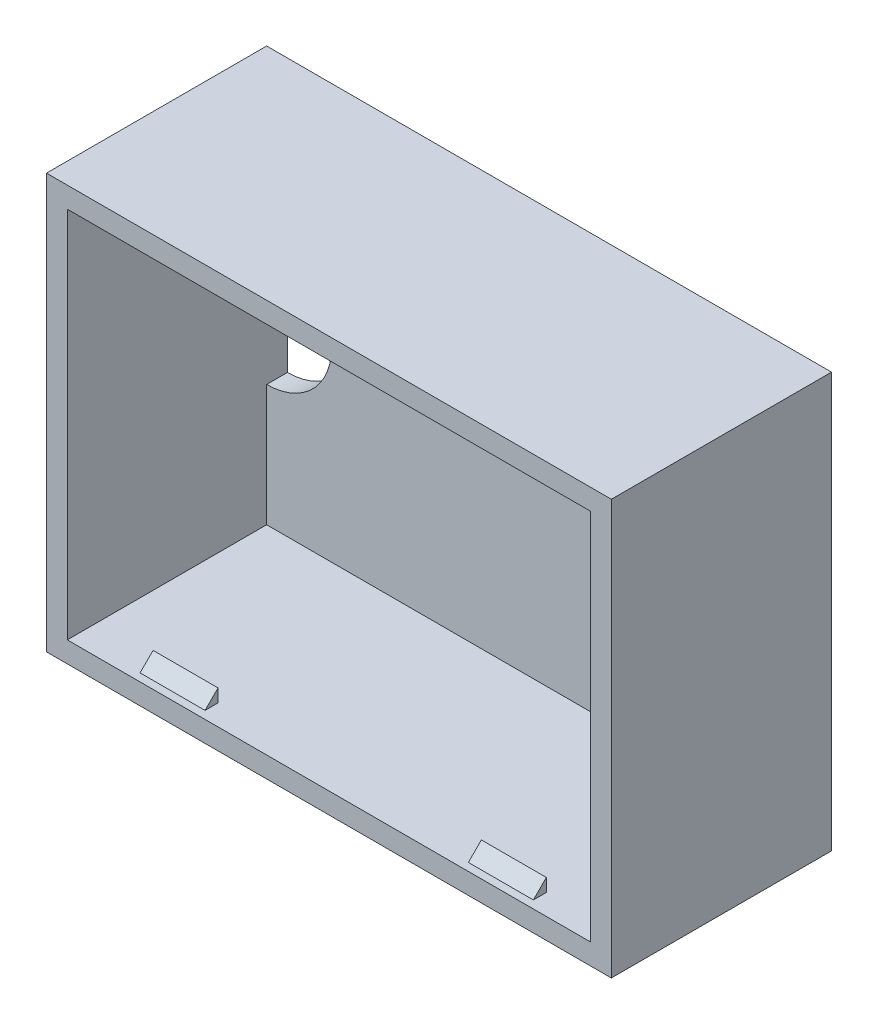
ISO-10303-21;
HEADER;
FILE_DESCRIPTION(('STEP AP214'),'2;1');
FILE_NAME('part.step','',(''),(''),'','','');
FILE_SCHEMA(('AUTOMOTIVE_DESIGN { 1 0 10303 214 1 1 1 1 }'));
ENDSEC;
DATA;
#1=APPLICATION_CONTEXT('core data for automotive mechanical design processes');
#2=APPLICATION_PROTOCOL_DEFINITION('international standard','automotive_design',2000,#1);
#3=PRODUCT_CONTEXT('',#1,'mechanical');
#4=PRODUCT('Part','Part','',(#3));
#5=PRODUCT_RELATED_PRODUCT_CATEGORY('part','',(#4));
#6=PRODUCT_DEFINITION_FORMATION('','',#4);
#7=PRODUCT_DEFINITION_CONTEXT('part definition',#1,'design');
#8=PRODUCT_DEFINITION('design','',#6,#7);
#9=PRODUCT_DEFINITION_SHAPE('','',#8);
#10=(LENGTH_UNIT() NAMED_UNIT(*) SI_UNIT(.MILLI.,.METRE.));
#11=(NAMED_UNIT(*) PLANE_ANGLE_UNIT() SI_UNIT($,.RADIAN.));
#12=(NAMED_UNIT(*) SI_UNIT($,.STERADIAN.) SOLID_ANGLE_UNIT());
#13=UNCERTAINTY_MEASURE_WITH_UNIT(LENGTH_MEASURE(1.E-05),#10,'distance_accuracy_value','');
#14=(GEOMETRIC_REPRESENTATION_CONTEXT(3) GLOBAL_UNCERTAINTY_ASSIGNED_CONTEXT((#13)) GLOBAL_UNIT_ASSIGNED_CONTEXT((#10,
#11,#12)) REPRESENTATION_CONTEXT('',''));
#15=CARTESIAN_POINT('',(0.,0.,0.));
#16=DIRECTION('',(0.,0.,1.));
#17=DIRECTION('',(1.,0.,0.));
#18=AXIS2_PLACEMENT_3D('',#15,#16,#17);
#19=CARTESIAN_POINT('',(21.73,14.35,16.94));
#20=DIRECTION('',(0.,-1.,0.));
#21=DIRECTION('',(0.,0.,-1.));
#22=AXIS2_PLACEMENT_3D('',#19,#20,#21);
#23=PLANE('',#22);
#24=DIRECTION('',(-1.,0.,0.));
#25=VECTOR('',#24,1.);
#26=CARTESIAN_POINT('',(0.,14.35,1.6));
#27=LINE('',#26,#25);
#28=CARTESIAN_POINT('',(20.13,14.35,1.6));
#29=VERTEX_POINT('',#28);
#30=CARTESIAN_POINT('',(-20.13,14.35,1.6));
#31=VERTEX_POINT('',#30);
#32=EDGE_CURVE('E294',#29,#31,#27,.T.);
#33=ORIENTED_EDGE('',*,*,#32,.F.);
#34=DIRECTION('',(0.,0.,-1.));
#35=VECTOR('',#34,1.);
#36=CARTESIAN_POINT('',(20.13,14.35,16.94));
#37=LINE('',#36,#35);
#38=CARTESIAN_POINT('',(20.13,14.35,16.94));
#39=VERTEX_POINT('',#38);
#40=EDGE_CURVE('E328',#39,#29,#37,.T.);
#41=ORIENTED_EDGE('',*,*,#40,.F.);
#42=DIRECTION('',(-1.,0.,0.));
#43=VECTOR('',#42,1.);
#44=CARTESIAN_POINT('',(0.,14.35,16.94));
#45=LINE('',#44,#43);
#46=CARTESIAN_POINT('',(-20.13,14.35,16.94));
#47=VERTEX_POINT('',#46);
#48=EDGE_CURVE('E349',#39,#47,#45,.T.);
#49=ORIENTED_EDGE('',*,*,#48,.T.);
#50=DIRECTION('',(0.,0.,-1.));
#51=VECTOR('',#50,1.);
#52=CARTESIAN_POINT('',(-20.13,14.35,16.94));
#53=LINE('',#52,#51);
#54=EDGE_CURVE('E322',#47,#31,#53,.T.);
#55=ORIENTED_EDGE('',*,*,#54,.T.);
#56=EDGE_LOOP('',(#33,#41,#49,#55));
#57=FACE_BOUND('',#56,.T.);
#58=DIRECTION('',(1.,0.,0.));
#59=VECTOR('',#58,1.);
#60=CARTESIAN_POINT('',(10.13,14.35,15.34));
#61=LINE('',#60,#59);
#62=CARTESIAN_POINT('',(10.13,14.35,15.34));
#63=VERTEX_POINT('',#62);
#64=CARTESIAN_POINT('',(15.13,14.35,15.34));
#65=VERTEX_POINT('',#64);
#66=EDGE_CURVE('E259',#63,#65,#61,.T.);
#67=ORIENTED_EDGE('',*,*,#66,.F.);
#68=DIRECTION('',(0.,0.,-1.));
#69=VECTOR('',#68,1.);
#70=CARTESIAN_POINT('',(10.13,14.35,16.34));
#71=LINE('',#70,#69);
#72=CARTESIAN_POINT('',(10.13,14.35,16.34));
#73=VERTEX_POINT('',#72);
#74=EDGE_CURVE('E229',#73,#63,#71,.T.);
#75=ORIENTED_EDGE('',*,*,#74,.F.);
#76=DIRECTION('',(-1.,0.,0.));
#77=VECTOR('',#76,1.);
#78=CARTESIAN_POINT('',(10.13,14.35,16.34));
#79=LINE('',#78,#77);
#80=CARTESIAN_POINT('',(15.13,14.35,16.34));
#81=VERTEX_POINT('',#80);
#82=EDGE_CURVE('E252',#81,#73,#79,.T.);
#83=ORIENTED_EDGE('',*,*,#82,.F.);
#84=DIRECTION('',(0.,0.,1.));
#85=VECTOR('',#84,1.);
#86=CARTESIAN_POINT('',(15.13,14.35,16.34));
#87=LINE('',#86,#85);
#88=EDGE_CURVE('E256',#65,#81,#87,.T.);
#89=ORIENTED_EDGE('',*,*,#88,.F.);
#90=EDGE_LOOP('',(#67,#75,#83,#89));
#91=FACE_BOUND('',#90,.T.);
#92=DIRECTION('',(1.,0.,0.));
#93=VECTOR('',#92,1.);
#94=CARTESIAN_POINT('',(-15.13,14.35,15.34));
#95=LINE('',#94,#93);
#96=CARTESIAN_POINT('',(-15.13,14.35,15.34));
#97=VERTEX_POINT('',#96);
#98=CARTESIAN_POINT('',(-10.13,14.35,15.34));
#99=VERTEX_POINT('',#98);
#100=EDGE_CURVE('E228',#97,#99,#95,.T.);
#101=ORIENTED_EDGE('',*,*,#100,.F.);
#102=DIRECTION('',(0.,0.,-1.));
#103=VECTOR('',#102,1.);
#104=CARTESIAN_POINT('',(-15.13,14.35,16.34));
#105=LINE('',#104,#103);
#106=CARTESIAN_POINT('',(-15.13,14.35,16.34));
#107=VERTEX_POINT('',#106);
#108=EDGE_CURVE('E224',#107,#97,#105,.T.);
#109=ORIENTED_EDGE('',*,*,#108,.F.);
#110=DIRECTION('',(-1.,0.,0.));
#111=VECTOR('',#110,1.);
#112=CARTESIAN_POINT('',(-15.13,14.35,16.34));
#113=LINE('',#112,#111);
#114=CARTESIAN_POINT('',(-10.13,14.35,16.34));
#115=VERTEX_POINT('',#114);
#116=EDGE_CURVE('E223',#115,#107,#113,.T.);
#117=ORIENTED_EDGE('',*,*,#116,.F.);
#118=DIRECTION('',(0.,0.,1.));
#119=VECTOR('',#118,1.);
#120=CARTESIAN_POINT('',(-10.13,14.35,16.34));
#121=LINE('',#120,#119);
#122=EDGE_CURVE('E232',#99,#115,#121,.T.);
#123=ORIENTED_EDGE('',*,*,#122,.F.);
#124=EDGE_LOOP('',(#101,#109,#117,#123));
#125=FACE_BOUND('',#124,.T.);
#126=ADVANCED_FACE('F47',(#57,#91,#125),#23,.T.);
#127=CARTESIAN_POINT('',(21.73,-14.35,16.94));
#128=DIRECTION('',(0.,1.,0.));
#129=DIRECTION('',(0.,0.,1.));
#130=AXIS2_PLACEMENT_3D('',#127,#128,#129);
#131=PLANE('',#130);
#132=DIRECTION('',(1.,0.,0.));
#133=VECTOR('',#132,1.);
#134=CARTESIAN_POINT('',(0.,-14.35,1.6));
#135=LINE('',#134,#133);
#136=CARTESIAN_POINT('',(-20.13,-14.35,1.6));
#137=VERTEX_POINT('',#136);
#138=CARTESIAN_POINT('',(20.13,-14.35,1.6));
#139=VERTEX_POINT('',#138);
#140=EDGE_CURVE('E337',#137,#139,#135,.T.);
#141=ORIENTED_EDGE('',*,*,#140,.F.);
#142=DIRECTION('',(0.,0.,-1.));
#143=VECTOR('',#142,1.);
#144=CARTESIAN_POINT('',(-20.13,-14.35,16.94));
#145=LINE('',#144,#143);
#146=CARTESIAN_POINT('',(-20.13,-14.35,16.94));
#147=VERTEX_POINT('',#146);
#148=EDGE_CURVE('E327',#147,#137,#145,.T.);
#149=ORIENTED_EDGE('',*,*,#148,.F.);
#150=DIRECTION('',(1.,0.,0.));
#151=VECTOR('',#150,1.);
#152=CARTESIAN_POINT('',(0.,-14.35,16.94));
#153=LINE('',#152,#151);
#154=CARTESIAN_POINT('',(20.13,-14.35,16.94));
#155=VERTEX_POINT('',#154);
#156=EDGE_CURVE('E355',#147,#155,#153,.T.);
#157=ORIENTED_EDGE('',*,*,#156,.T.);
#158=DIRECTION('',(0.,0.,-1.));
#159=VECTOR('',#158,1.);
#160=CARTESIAN_POINT('',(20.13,-14.35,16.94));
#161=LINE('',#160,#159);
#162=EDGE_CURVE('E332',#155,#139,#161,.T.);
#163=ORIENTED_EDGE('',*,*,#162,.T.);
#164=EDGE_LOOP('',(#141,#149,#157,#163));
#165=FACE_BOUND('',#164,.T.);
#166=DIRECTION('',(-1.,0.,0.));
#167=VECTOR('',#166,1.);
#168=CARTESIAN_POINT('',(-10.13,-14.35,15.34));
#169=LINE('',#168,#167);
#170=CARTESIAN_POINT('',(-10.13,-14.35,15.34));
#171=VERTEX_POINT('',#170);
#172=CARTESIAN_POINT('',(-15.13,-14.35,15.34));
#173=VERTEX_POINT('',#172);
#174=EDGE_CURVE('E309',#171,#173,#169,.T.);
#175=ORIENTED_EDGE('',*,*,#174,.F.);
#176=DIRECTION('',(0.,0.,-1.));
#177=VECTOR('',#176,1.);
#178=CARTESIAN_POINT('',(-10.13,-14.35,16.34));
#179=LINE('',#178,#177);
#180=CARTESIAN_POINT('',(-10.13,-14.35,16.34));
#181=VERTEX_POINT('',#180);
#182=EDGE_CURVE('E279',#181,#171,#179,.T.);
#183=ORIENTED_EDGE('',*,*,#182,.F.);
#184=DIRECTION('',(1.,0.,0.));
#185=VECTOR('',#184,1.);
#186=CARTESIAN_POINT('',(-10.13,-14.35,16.34));
#187=LINE('',#186,#185);
#188=CARTESIAN_POINT('',(-15.13,-14.35,16.34));
#189=VERTEX_POINT('',#188);
#190=EDGE_CURVE('E302',#189,#181,#187,.T.);
#191=ORIENTED_EDGE('',*,*,#190,.F.);
#192=DIRECTION('',(0.,0.,1.));
#193=VECTOR('',#192,1.);
#194=CARTESIAN_POINT('',(-15.13,-14.35,16.34));
#195=LINE('',#194,#193);
#196=EDGE_CURVE('E306',#173,#189,#195,.T.);
#197=ORIENTED_EDGE('',*,*,#196,.F.);
#198=EDGE_LOOP('',(#175,#183,#191,#197));
#199=FACE_BOUND('',#198,.T.);
#200=DIRECTION('',(-1.,0.,0.));
#201=VECTOR('',#200,1.);
#202=CARTESIAN_POINT('',(15.13,-14.35,15.34));
#203=LINE('',#202,#201);
#204=CARTESIAN_POINT('',(15.13,-14.35,15.34));
#205=VERTEX_POINT('',#204);
#206=CARTESIAN_POINT('',(10.13,-14.35,15.34));
#207=VERTEX_POINT('',#206);
#208=EDGE_CURVE('E278',#205,#207,#203,.T.);
#209=ORIENTED_EDGE('',*,*,#208,.F.);
#210=DIRECTION('',(0.,0.,-1.));
#211=VECTOR('',#210,1.);
#212=CARTESIAN_POINT('',(15.13,-14.35,16.34));
#213=LINE('',#212,#211);
#214=CARTESIAN_POINT('',(15.13,-14.35,16.34));
#215=VERTEX_POINT('',#214);
#216=EDGE_CURVE('E274',#215,#205,#213,.T.);
#217=ORIENTED_EDGE('',*,*,#216,.F.);
#218=DIRECTION('',(1.,0.,0.));
#219=VECTOR('',#218,1.);
#220=CARTESIAN_POINT('',(15.13,-14.35,16.34));
#221=LINE('',#220,#219);
#222=CARTESIAN_POINT('',(10.13,-14.35,16.34));
#223=VERTEX_POINT('',#222);
#224=EDGE_CURVE('E273',#223,#215,#221,.T.);
#225=ORIENTED_EDGE('',*,*,#224,.F.);
#226=DIRECTION('',(0.,0.,1.));
#227=VECTOR('',#226,1.);
#228=CARTESIAN_POINT('',(10.13,-14.35,16.34));
#229=LINE('',#228,#227);
#230=EDGE_CURVE('E282',#207,#223,#229,.T.);
#231=ORIENTED_EDGE('',*,*,#230,.F.);
#232=EDGE_LOOP('',(#209,#217,#225,#231));
#233=FACE_BOUND('',#232,.T.);
#234=ADVANCED_FACE('F448',(#165,#199,#233),#131,.T.);
#235=CARTESIAN_POINT('',(0.,0.,16.94));
#236=DIRECTION('',(0.,0.,-1.));
#237=DIRECTION('',(-1.,0.,0.));
#238=AXIS2_PLACEMENT_3D('',#235,#236,#237);
#239=PLANE('',#238);
#240=DIRECTION('',(-1.,0.,0.));
#241=VECTOR('',#240,1.);
#242=CARTESIAN_POINT('',(21.73,15.95,16.94));
#243=LINE('',#242,#241);
#244=CARTESIAN_POINT('',(21.73,15.95,16.94));
#245=VERTEX_POINT('',#244);
#246=CARTESIAN_POINT('',(-21.73,15.95,16.94));
#247=VERTEX_POINT('',#246);
#248=EDGE_CURVE('E361',#245,#247,#243,.T.);
#249=ORIENTED_EDGE('',*,*,#248,.T.);
#250=DIRECTION('',(0.,-1.,0.));
#251=VECTOR('',#250,1.);
#252=CARTESIAN_POINT('',(-21.73,-15.95,16.94));
#253=LINE('',#252,#251);
#254=CARTESIAN_POINT('',(-21.73,-15.95,16.94));
#255=VERTEX_POINT('',#254);
#256=EDGE_CURVE('E365',#247,#255,#253,.T.);
#257=ORIENTED_EDGE('',*,*,#256,.T.);
#258=DIRECTION('',(1.,0.,0.));
#259=VECTOR('',#258,1.);
#260=CARTESIAN_POINT('',(21.73,-15.95,16.94));
#261=LINE('',#260,#259);
#262=CARTESIAN_POINT('',(21.73,-15.95,16.94));
#263=VERTEX_POINT('',#262);
#264=EDGE_CURVE('E369',#255,#263,#261,.T.);
#265=ORIENTED_EDGE('',*,*,#264,.T.);
#266=DIRECTION('',(0.,1.,0.));
#267=VECTOR('',#266,1.);
#268=CARTESIAN_POINT('',(21.73,-15.95,16.94));
#269=LINE('',#268,#267);
#270=EDGE_CURVE('E372',#263,#245,#269,.T.);
#271=ORIENTED_EDGE('',*,*,#270,.T.);
#272=EDGE_LOOP('',(#249,#257,#265,#271));
#273=FACE_BOUND('',#272,.T.);
#274=ORIENTED_EDGE('',*,*,#48,.F.);
#275=DIRECTION('',(0.,1.,0.));
#276=VECTOR('',#275,1.);
#277=CARTESIAN_POINT('',(20.13,0.,16.94));
#278=LINE('',#277,#276);
#279=EDGE_CURVE('E333',#155,#39,#278,.T.);
#280=ORIENTED_EDGE('',*,*,#279,.F.);
#281=ORIENTED_EDGE('',*,*,#156,.F.);
#282=DIRECTION('',(0.,-1.,0.));
#283=VECTOR('',#282,1.);
#284=CARTESIAN_POINT('',(-20.13,0.,16.94));
#285=LINE('',#284,#283);
#286=EDGE_CURVE('E352',#47,#147,#285,.T.);
#287=ORIENTED_EDGE('',*,*,#286,.F.);
#288=EDGE_LOOP('',(#274,#280,#281,#287));
#289=FACE_BOUND('',#288,.T.);
#290=ADVANCED_FACE('F455',(#273,#289),#239,.F.);
#291=CARTESIAN_POINT('',(21.73,15.95,16.94));
#292=DIRECTION('',(0.,-1.,0.));
#293=DIRECTION('',(0.,0.,-1.));
#294=AXIS2_PLACEMENT_3D('',#291,#292,#293);
#295=PLANE('',#294);
#296=DIRECTION('',(-1.,0.,0.));
#297=VECTOR('',#296,1.);
#298=CARTESIAN_POINT('',(21.73,15.95,0.));
#299=LINE('',#298,#297);
#300=CARTESIAN_POINT('',(21.73,15.95,0.));
#301=VERTEX_POINT('',#300);
#302=CARTESIAN_POINT('',(-21.73,15.95,0.));
#303=VERTEX_POINT('',#302);
#304=EDGE_CURVE('E326',#301,#303,#299,.T.);
#305=ORIENTED_EDGE('',*,*,#304,.T.);
#306=DIRECTION('',(0.,0.,-1.));
#307=VECTOR('',#306,1.);
#308=CARTESIAN_POINT('',(-21.73,15.95,16.94));
#309=LINE('',#308,#307);
#310=EDGE_CURVE('E398',#247,#303,#309,.T.);
#311=ORIENTED_EDGE('',*,*,#310,.F.);
#312=ORIENTED_EDGE('',*,*,#248,.F.);
#313=DIRECTION('',(0.,0.,-1.));
#314=VECTOR('',#313,1.);
#315=CARTESIAN_POINT('',(21.73,15.95,16.94));
#316=LINE('',#315,#314);
#317=EDGE_CURVE('E375',#245,#301,#316,.T.);
#318=ORIENTED_EDGE('',*,*,#317,.T.);
#319=EDGE_LOOP('',(#305,#311,#312,#318));
#320=FACE_BOUND('',#319,.T.);
#321=ADVANCED_FACE('F475',(#320),#295,.F.);
#322=CARTESIAN_POINT('',(-21.73,-15.95,16.94));
#323=DIRECTION('',(1.,0.,0.));
#324=DIRECTION('',(0.,0.,-1.));
#325=AXIS2_PLACEMENT_3D('',#322,#323,#324);
#326=PLANE('',#325);
#327=DIRECTION('',(0.,-1.,0.));
#328=VECTOR('',#327,1.);
#329=CARTESIAN_POINT('',(-21.73,-15.95,0.));
#330=LINE('',#329,#328);
#331=CARTESIAN_POINT('',(-21.73,-15.95,0.));
#332=VERTEX_POINT('',#331);
#333=EDGE_CURVE('E379',#303,#332,#330,.T.);
#334=ORIENTED_EDGE('',*,*,#333,.T.);
#335=DIRECTION('',(0.,0.,-1.));
#336=VECTOR('',#335,1.);
#337=CARTESIAN_POINT('',(-21.73,-15.95,16.94));
#338=LINE('',#337,#336);
#339=EDGE_CURVE('E394',#255,#332,#338,.T.);
#340=ORIENTED_EDGE('',*,*,#339,.F.);
#341=ORIENTED_EDGE('',*,*,#256,.F.);
#342=ORIENTED_EDGE('',*,*,#310,.T.);
#343=EDGE_LOOP('',(#334,#340,#341,#342));
#344=FACE_BOUND('',#343,.T.);
#345=ADVANCED_FACE('F486',(#344),#326,.F.);
#346=CARTESIAN_POINT('',(21.73,-15.95,16.94));
#347=DIRECTION('',(0.,1.,0.));
#348=DIRECTION('',(0.,0.,1.));
#349=AXIS2_PLACEMENT_3D('',#346,#347,#348);
#350=PLANE('',#349);
#351=DIRECTION('',(1.,0.,0.));
#352=VECTOR('',#351,1.);
#353=CARTESIAN_POINT('',(21.73,-15.95,0.));
#354=LINE('',#353,#352);
#355=CARTESIAN_POINT('',(21.73,-15.95,0.));
#356=VERTEX_POINT('',#355);
#357=EDGE_CURVE('E382',#332,#356,#354,.T.);
#358=ORIENTED_EDGE('',*,*,#357,.T.);
#359=DIRECTION('',(0.,0.,-1.));
#360=VECTOR('',#359,1.);
#361=CARTESIAN_POINT('',(21.73,-15.95,16.94));
#362=LINE('',#361,#360);
#363=EDGE_CURVE('E390',#263,#356,#362,.T.);
#364=ORIENTED_EDGE('',*,*,#363,.F.);
#365=ORIENTED_EDGE('',*,*,#264,.F.);
#366=ORIENTED_EDGE('',*,*,#339,.T.);
#367=EDGE_LOOP('',(#358,#364,#365,#366));
#368=FACE_BOUND('',#367,.T.);
#369=ADVANCED_FACE('F482',(#368),#350,.F.);
#370=CARTESIAN_POINT('',(21.73,-15.95,16.94));
#371=DIRECTION('',(-1.,0.,0.));
#372=DIRECTION('',(0.,0.,1.));
#373=AXIS2_PLACEMENT_3D('',#370,#371,#372);
#374=PLANE('',#373);
#375=DIRECTION('',(0.,1.,0.));
#376=VECTOR('',#375,1.);
#377=CARTESIAN_POINT('',(21.73,-15.95,0.));
#378=LINE('',#377,#376);
#379=EDGE_CURVE('E366',#356,#301,#378,.T.);
#380=ORIENTED_EDGE('',*,*,#379,.T.);
#381=ORIENTED_EDGE('',*,*,#317,.F.);
#382=ORIENTED_EDGE('',*,*,#270,.F.);
#383=ORIENTED_EDGE('',*,*,#363,.T.);
#384=EDGE_LOOP('',(#380,#381,#382,#383));
#385=FACE_BOUND('',#384,.T.);
#386=ADVANCED_FACE('F479',(#385),#374,.F.);
#387=CARTESIAN_POINT('',(0.,0.,0.));
#388=DIRECTION('',(0.,0.,-1.));
#389=DIRECTION('',(-1.,0.,0.));
#390=AXIS2_PLACEMENT_3D('',#387,#388,#389);
#391=PLANE('',#390);
#392=CARTESIAN_POINT('',(-20.13,0.,0.));
#393=DIRECTION('',(0.,0.,1.));
#394=DIRECTION('',(1.,0.,0.));
#395=AXIS2_PLACEMENT_3D('',#392,#393,#394);
#396=CIRCLE('',#395,5.);
#397=CARTESIAN_POINT('',(-20.13,-5.00000000000001,0.));
#398=VERTEX_POINT('',#397);
#399=CARTESIAN_POINT('',(-20.13,4.99999999999999,0.));
#400=VERTEX_POINT('',#399);
#401=EDGE_CURVE('E69',#398,#400,#396,.T.);
#402=ORIENTED_EDGE('',*,*,#401,.T.);
#403=DIRECTION('',(0.,-1.,0.));
#404=VECTOR('',#403,1.);
#405=CARTESIAN_POINT('',(-20.13,4.99999999999999,0.));
#406=LINE('',#405,#404);
#407=EDGE_CURVE('E200',#400,#398,#406,.T.);
#408=ORIENTED_EDGE('',*,*,#407,.T.);
#409=EDGE_LOOP('',(#402,#408));
#410=FACE_BOUND('',#409,.T.);
#411=ORIENTED_EDGE('',*,*,#304,.F.);
#412=ORIENTED_EDGE('',*,*,#379,.F.);
#413=ORIENTED_EDGE('',*,*,#357,.F.);
#414=ORIENTED_EDGE('',*,*,#333,.F.);
#415=EDGE_LOOP('',(#411,#412,#413,#414));
#416=FACE_BOUND('',#415,.T.);
#417=ADVANCED_FACE('F208',(#410,#416),#391,.T.);
#418=CARTESIAN_POINT('',(-20.13,-15.95,16.94));
#419=DIRECTION('',(1.,0.,0.));
#420=DIRECTION('',(0.,0.,-1.));
#421=AXIS2_PLACEMENT_3D('',#418,#419,#420);
#422=PLANE('',#421);
#423=DIRECTION('',(0.,-1.,0.));
#424=VECTOR('',#423,1.);
#425=CARTESIAN_POINT('',(-20.13,0.,1.6));
#426=LINE('',#425,#424);
#427=CARTESIAN_POINT('',(-20.13,4.99999999999999,1.6));
#428=VERTEX_POINT('',#427);
#429=EDGE_CURVE('E334',#31,#428,#426,.T.);
#430=ORIENTED_EDGE('',*,*,#429,.F.);
#431=ORIENTED_EDGE('',*,*,#54,.F.);
#432=ORIENTED_EDGE('',*,*,#286,.T.);
#433=ORIENTED_EDGE('',*,*,#148,.T.);
#434=CARTESIAN_POINT('',(-20.13,-5.,1.6));
#435=VERTEX_POINT('',#434);
#436=EDGE_CURVE('E321',#435,#137,#426,.T.);
#437=ORIENTED_EDGE('',*,*,#436,.F.);
#438=DIRECTION('',(0.,0.,1.));
#439=VECTOR('',#438,1.);
#440=CARTESIAN_POINT('',(-20.13,-5.00000000000001,0.));
#441=LINE('',#440,#439);
#442=EDGE_CURVE('E64',#398,#435,#441,.T.);
#443=ORIENTED_EDGE('',*,*,#442,.F.);
#444=ORIENTED_EDGE('',*,*,#407,.F.);
#445=DIRECTION('',(0.,0.,1.));
#446=VECTOR('',#445,1.);
#447=CARTESIAN_POINT('',(-20.13,4.99999999999999,0.));
#448=LINE('',#447,#446);
#449=EDGE_CURVE('E193',#400,#428,#448,.T.);
#450=ORIENTED_EDGE('',*,*,#449,.T.);
#451=EDGE_LOOP('',(#430,#431,#432,#433,#437,#443,#444,#450));
#452=FACE_BOUND('',#451,.T.);
#453=ADVANCED_FACE('F203',(#452),#422,.T.);
#454=CARTESIAN_POINT('',(20.13,-15.95,16.94));
#455=DIRECTION('',(-1.,0.,0.));
#456=DIRECTION('',(0.,0.,1.));
#457=AXIS2_PLACEMENT_3D('',#454,#455,#456);
#458=PLANE('',#457);
#459=DIRECTION('',(0.,1.,0.));
#460=VECTOR('',#459,1.);
#461=CARTESIAN_POINT('',(20.13,0.,1.6));
#462=LINE('',#461,#460);
#463=EDGE_CURVE('E343',#139,#29,#462,.T.);
#464=ORIENTED_EDGE('',*,*,#463,.F.);
#465=ORIENTED_EDGE('',*,*,#162,.F.);
#466=ORIENTED_EDGE('',*,*,#279,.T.);
#467=ORIENTED_EDGE('',*,*,#40,.T.);
#468=EDGE_LOOP('',(#464,#465,#466,#467));
#469=FACE_BOUND('',#468,.T.);
#470=ADVANCED_FACE('F464',(#469),#458,.T.);
#471=CARTESIAN_POINT('',(0.,0.,1.6));
#472=DIRECTION('',(0.,0.,-1.));
#473=DIRECTION('',(-1.,0.,0.));
#474=AXIS2_PLACEMENT_3D('',#471,#472,#473);
#475=PLANE('',#474);
#476=CARTESIAN_POINT('',(-20.13,0.,1.6));
#477=DIRECTION('',(0.,0.,1.));
#478=DIRECTION('',(1.,0.,0.));
#479=AXIS2_PLACEMENT_3D('',#476,#477,#478);
#480=CIRCLE('',#479,5.);
#481=EDGE_CURVE('E196',#435,#428,#480,.T.);
#482=ORIENTED_EDGE('',*,*,#481,.F.);
#483=ORIENTED_EDGE('',*,*,#436,.T.);
#484=ORIENTED_EDGE('',*,*,#140,.T.);
#485=ORIENTED_EDGE('',*,*,#463,.T.);
#486=ORIENTED_EDGE('',*,*,#32,.T.);
#487=ORIENTED_EDGE('',*,*,#429,.T.);
#488=EDGE_LOOP('',(#482,#483,#484,#485,#486,#487));
#489=FACE_BOUND('',#488,.T.);
#490=ADVANCED_FACE('F467',(#489),#475,.F.);
#491=CARTESIAN_POINT('',(-10.13,-13.35,16.34));
#492=DIRECTION('',(-1.,0.,0.));
#493=DIRECTION('',(0.,0.,1.));
#494=AXIS2_PLACEMENT_3D('',#491,#492,#493);
#495=PLANE('',#494);
#496=DIRECTION('',(0.,-1.,0.));
#497=VECTOR('',#496,1.);
#498=CARTESIAN_POINT('',(-10.13,-13.35,15.34));
#499=LINE('',#498,#497);
#500=CARTESIAN_POINT('',(-10.13,-13.35,15.34));
#501=VERTEX_POINT('',#500);
#502=EDGE_CURVE('E244',#501,#171,#499,.T.);
#503=ORIENTED_EDGE('',*,*,#502,.F.);
#504=DIRECTION('',(0.,-0.70710678118655,0.707106781186545));
#505=VECTOR('',#504,1.);
#506=CARTESIAN_POINT('',(-10.13,-13.35,15.34));
#507=LINE('',#506,#505);
#508=EDGE_CURVE('E402',#501,#181,#507,.T.);
#509=ORIENTED_EDGE('',*,*,#508,.T.);
#510=ORIENTED_EDGE('',*,*,#182,.T.);
#511=EDGE_LOOP('',(#503,#509,#510));
#512=FACE_BOUND('',#511,.T.);
#513=ADVANCED_FACE('F471',(#512),#495,.F.);
#514=CARTESIAN_POINT('',(-10.13,-13.35,15.34));
#515=DIRECTION('',(0.,0.,1.));
#516=DIRECTION('',(1.,0.,0.));
#517=AXIS2_PLACEMENT_3D('',#514,#515,#516);
#518=PLANE('',#517);
#519=ORIENTED_EDGE('',*,*,#174,.T.);
#520=DIRECTION('',(0.,-1.,0.));
#521=VECTOR('',#520,1.);
#522=CARTESIAN_POINT('',(-15.13,-13.35,15.34));
#523=LINE('',#522,#521);
#524=CARTESIAN_POINT('',(-15.13,-13.35,15.34));
#525=VERTEX_POINT('',#524);
#526=EDGE_CURVE('E297',#525,#173,#523,.T.);
#527=ORIENTED_EDGE('',*,*,#526,.F.);
#528=DIRECTION('',(-1.,0.,0.));
#529=VECTOR('',#528,1.);
#530=CARTESIAN_POINT('',(-10.13,-13.35,15.34));
#531=LINE('',#530,#529);
#532=EDGE_CURVE('E301',#501,#525,#531,.T.);
#533=ORIENTED_EDGE('',*,*,#532,.F.);
#534=ORIENTED_EDGE('',*,*,#502,.T.);
#535=EDGE_LOOP('',(#519,#527,#533,#534));
#536=FACE_BOUND('',#535,.T.);
#537=ADVANCED_FACE('F656',(#536),#518,.F.);
#538=CARTESIAN_POINT('',(-15.13,-13.35,16.34));
#539=DIRECTION('',(1.,0.,0.));
#540=DIRECTION('',(0.,0.,-1.));
#541=AXIS2_PLACEMENT_3D('',#538,#539,#540);
#542=PLANE('',#541);
#543=ORIENTED_EDGE('',*,*,#196,.T.);
#544=DIRECTION('',(0.,0.70710678118655,-0.707106781186545));
#545=VECTOR('',#544,1.);
#546=CARTESIAN_POINT('',(-15.13,-13.35,15.34));
#547=LINE('',#546,#545);
#548=EDGE_CURVE('E405',#189,#525,#547,.T.);
#549=ORIENTED_EDGE('',*,*,#548,.T.);
#550=ORIENTED_EDGE('',*,*,#526,.T.);
#551=EDGE_LOOP('',(#543,#549,#550));
#552=FACE_BOUND('',#551,.T.);
#553=ADVANCED_FACE('F461',(#552),#542,.F.);
#554=CARTESIAN_POINT('',(15.13,-13.35,16.34));
#555=DIRECTION('',(-1.,0.,0.));
#556=DIRECTION('',(0.,0.,1.));
#557=AXIS2_PLACEMENT_3D('',#554,#555,#556);
#558=PLANE('',#557);
#559=DIRECTION('',(0.,-1.,0.));
#560=VECTOR('',#559,1.);
#561=CARTESIAN_POINT('',(15.13,-13.35,15.34));
#562=LINE('',#561,#560);
#563=CARTESIAN_POINT('',(15.13,-13.35,15.34));
#564=VERTEX_POINT('',#563);
#565=EDGE_CURVE('E291',#564,#205,#562,.T.);
#566=ORIENTED_EDGE('',*,*,#565,.F.);
#567=DIRECTION('',(0.,-0.70710678118655,0.707106781186545));
#568=VECTOR('',#567,1.);
#569=CARTESIAN_POINT('',(15.13,-13.35,15.34));
#570=LINE('',#569,#568);
#571=EDGE_CURVE('E408',#564,#215,#570,.T.);
#572=ORIENTED_EDGE('',*,*,#571,.T.);
#573=ORIENTED_EDGE('',*,*,#216,.T.);
#574=EDGE_LOOP('',(#566,#572,#573));
#575=FACE_BOUND('',#574,.T.);
#576=ADVANCED_FACE('F637',(#575),#558,.F.);
#577=CARTESIAN_POINT('',(15.13,-13.35,15.34));
#578=DIRECTION('',(0.,0.,1.));
#579=DIRECTION('',(1.,0.,0.));
#580=AXIS2_PLACEMENT_3D('',#577,#578,#579);
#581=PLANE('',#580);
#582=ORIENTED_EDGE('',*,*,#208,.T.);
#583=DIRECTION('',(0.,-1.,0.));
#584=VECTOR('',#583,1.);
#585=CARTESIAN_POINT('',(10.13,-13.35,15.34));
#586=LINE('',#585,#584);
#587=CARTESIAN_POINT('',(10.13,-13.35,15.34));
#588=VERTEX_POINT('',#587);
#589=EDGE_CURVE('E272',#588,#207,#586,.T.);
#590=ORIENTED_EDGE('',*,*,#589,.F.);
#591=DIRECTION('',(-1.,0.,0.));
#592=VECTOR('',#591,1.);
#593=CARTESIAN_POINT('',(15.13,-13.35,15.34));
#594=LINE('',#593,#592);
#595=EDGE_CURVE('E268',#564,#588,#594,.T.);
#596=ORIENTED_EDGE('',*,*,#595,.F.);
#597=ORIENTED_EDGE('',*,*,#565,.T.);
#598=EDGE_LOOP('',(#582,#590,#596,#597));
#599=FACE_BOUND('',#598,.T.);
#600=ADVANCED_FACE('F627',(#599),#581,.F.);
#601=CARTESIAN_POINT('',(10.13,-13.35,16.34));
#602=DIRECTION('',(1.,0.,0.));
#603=DIRECTION('',(0.,0.,-1.));
#604=AXIS2_PLACEMENT_3D('',#601,#602,#603);
#605=PLANE('',#604);
#606=ORIENTED_EDGE('',*,*,#230,.T.);
#607=DIRECTION('',(0.,0.70710678118655,-0.707106781186545));
#608=VECTOR('',#607,1.);
#609=CARTESIAN_POINT('',(10.13,-13.35,15.34));
#610=LINE('',#609,#608);
#611=EDGE_CURVE('E411',#223,#588,#610,.T.);
#612=ORIENTED_EDGE('',*,*,#611,.T.);
#613=ORIENTED_EDGE('',*,*,#589,.T.);
#614=EDGE_LOOP('',(#606,#612,#613));
#615=FACE_BOUND('',#614,.T.);
#616=ADVANCED_FACE('F445',(#615),#605,.F.);
#617=CARTESIAN_POINT('',(10.13,13.35,16.34));
#618=DIRECTION('',(1.,0.,0.));
#619=DIRECTION('',(0.,0.,-1.));
#620=AXIS2_PLACEMENT_3D('',#617,#618,#619);
#621=PLANE('',#620);
#622=DIRECTION('',(0.,1.,0.));
#623=VECTOR('',#622,1.);
#624=CARTESIAN_POINT('',(10.13,13.35,15.34));
#625=LINE('',#624,#623);
#626=CARTESIAN_POINT('',(10.13,13.35,15.34));
#627=VERTEX_POINT('',#626);
#628=EDGE_CURVE('E216',#627,#63,#625,.T.);
#629=ORIENTED_EDGE('',*,*,#628,.F.);
#630=DIRECTION('',(0.,0.70710678118655,0.707106781186545));
#631=VECTOR('',#630,1.);
#632=CARTESIAN_POINT('',(10.13,13.35,15.34));
#633=LINE('',#632,#631);
#634=EDGE_CURVE('E57',#627,#73,#633,.T.);
#635=ORIENTED_EDGE('',*,*,#634,.T.);
#636=ORIENTED_EDGE('',*,*,#74,.T.);
#637=EDGE_LOOP('',(#629,#635,#636));
#638=FACE_BOUND('',#637,.T.);
#639=ADVANCED_FACE('F423',(#638),#621,.F.);
#640=CARTESIAN_POINT('',(10.13,13.35,15.34));
#641=DIRECTION('',(0.,0.,1.));
#642=DIRECTION('',(1.,0.,0.));
#643=AXIS2_PLACEMENT_3D('',#640,#641,#642);
#644=PLANE('',#643);
#645=ORIENTED_EDGE('',*,*,#66,.T.);
#646=DIRECTION('',(0.,1.,0.));
#647=VECTOR('',#646,1.);
#648=CARTESIAN_POINT('',(15.13,13.35,15.34));
#649=LINE('',#648,#647);
#650=CARTESIAN_POINT('',(15.13,13.35,15.34));
#651=VERTEX_POINT('',#650);
#652=EDGE_CURVE('E247',#651,#65,#649,.T.);
#653=ORIENTED_EDGE('',*,*,#652,.F.);
#654=DIRECTION('',(1.,0.,0.));
#655=VECTOR('',#654,1.);
#656=CARTESIAN_POINT('',(10.13,13.35,15.34));
#657=LINE('',#656,#655);
#658=EDGE_CURVE('E251',#627,#651,#657,.T.);
#659=ORIENTED_EDGE('',*,*,#658,.F.);
#660=ORIENTED_EDGE('',*,*,#628,.T.);
#661=EDGE_LOOP('',(#645,#653,#659,#660));
#662=FACE_BOUND('',#661,.T.);
#663=ADVANCED_FACE('F436',(#662),#644,.F.);
#664=CARTESIAN_POINT('',(15.13,13.35,16.34));
#665=DIRECTION('',(-1.,0.,0.));
#666=DIRECTION('',(0.,0.,1.));
#667=AXIS2_PLACEMENT_3D('',#664,#665,#666);
#668=PLANE('',#667);
#669=ORIENTED_EDGE('',*,*,#88,.T.);
#670=DIRECTION('',(0.,-0.70710678118655,-0.707106781186545));
#671=VECTOR('',#670,1.);
#672=CARTESIAN_POINT('',(15.13,13.35,15.34));
#673=LINE('',#672,#671);
#674=EDGE_CURVE('E11',#81,#651,#673,.T.);
#675=ORIENTED_EDGE('',*,*,#674,.T.);
#676=ORIENTED_EDGE('',*,*,#652,.T.);
#677=EDGE_LOOP('',(#669,#675,#676));
#678=FACE_BOUND('',#677,.T.);
#679=ADVANCED_FACE('F434',(#678),#668,.F.);
#680=CARTESIAN_POINT('',(-15.13,13.35,16.34));
#681=DIRECTION('',(1.,0.,0.));
#682=DIRECTION('',(0.,0.,-1.));
#683=AXIS2_PLACEMENT_3D('',#680,#681,#682);
#684=PLANE('',#683);
#685=DIRECTION('',(0.,1.,0.));
#686=VECTOR('',#685,1.);
#687=CARTESIAN_POINT('',(-15.13,13.35,15.34));
#688=LINE('',#687,#686);
#689=CARTESIAN_POINT('',(-15.13,13.35,15.34));
#690=VERTEX_POINT('',#689);
#691=EDGE_CURVE('E241',#690,#97,#688,.T.);
#692=ORIENTED_EDGE('',*,*,#691,.F.);
#693=DIRECTION('',(0.,0.70710678118655,0.707106781186545));
#694=VECTOR('',#693,1.);
#695=CARTESIAN_POINT('',(-15.13,13.35,15.34));
#696=LINE('',#695,#694);
#697=EDGE_CURVE('E414',#690,#107,#696,.T.);
#698=ORIENTED_EDGE('',*,*,#697,.T.);
#699=ORIENTED_EDGE('',*,*,#108,.T.);
#700=EDGE_LOOP('',(#692,#698,#699));
#701=FACE_BOUND('',#700,.T.);
#702=ADVANCED_FACE('F443',(#701),#684,.F.);
#703=CARTESIAN_POINT('',(-15.13,13.35,15.34));
#704=DIRECTION('',(0.,0.,1.));
#705=DIRECTION('',(1.,0.,0.));
#706=AXIS2_PLACEMENT_3D('',#703,#704,#705);
#707=PLANE('',#706);
#708=ORIENTED_EDGE('',*,*,#100,.T.);
#709=DIRECTION('',(0.,1.,0.));
#710=VECTOR('',#709,1.);
#711=CARTESIAN_POINT('',(-10.13,13.35,15.34));
#712=LINE('',#711,#710);
#713=CARTESIAN_POINT('',(-10.13,13.35,15.34));
#714=VERTEX_POINT('',#713);
#715=EDGE_CURVE('E222',#714,#99,#712,.T.);
#716=ORIENTED_EDGE('',*,*,#715,.F.);
#717=DIRECTION('',(1.,0.,0.));
#718=VECTOR('',#717,1.);
#719=CARTESIAN_POINT('',(-15.13,13.35,15.34));
#720=LINE('',#719,#718);
#721=EDGE_CURVE('E218',#690,#714,#720,.T.);
#722=ORIENTED_EDGE('',*,*,#721,.F.);
#723=ORIENTED_EDGE('',*,*,#691,.T.);
#724=EDGE_LOOP('',(#708,#716,#722,#723));
#725=FACE_BOUND('',#724,.T.);
#726=ADVANCED_FACE('F524',(#725),#707,.F.);
#727=CARTESIAN_POINT('',(-10.13,13.35,16.34));
#728=DIRECTION('',(-1.,0.,0.));
#729=DIRECTION('',(0.,0.,1.));
#730=AXIS2_PLACEMENT_3D('',#727,#728,#729);
#731=PLANE('',#730);
#732=ORIENTED_EDGE('',*,*,#122,.T.);
#733=DIRECTION('',(0.,-0.70710678118655,-0.707106781186545));
#734=VECTOR('',#733,1.);
#735=CARTESIAN_POINT('',(-10.13,13.35,15.34));
#736=LINE('',#735,#734);
#737=EDGE_CURVE('E417',#115,#714,#736,.T.);
#738=ORIENTED_EDGE('',*,*,#737,.T.);
#739=ORIENTED_EDGE('',*,*,#715,.T.);
#740=EDGE_LOOP('',(#732,#738,#739));
#741=FACE_BOUND('',#740,.T.);
#742=ADVANCED_FACE('F502',(#741),#731,.F.);
#743=CARTESIAN_POINT('',(0.,-13.35,15.34));
#744=DIRECTION('',(0.,0.707106781186545,0.70710678118655));
#745=DIRECTION('',(-1.,0.,0.));
#746=AXIS2_PLACEMENT_3D('',#743,#744,#745);
#747=PLANE('',#746);
#748=ORIENTED_EDGE('',*,*,#548,.F.);
#749=ORIENTED_EDGE('',*,*,#190,.T.);
#750=ORIENTED_EDGE('',*,*,#508,.F.);
#751=ORIENTED_EDGE('',*,*,#532,.T.);
#752=EDGE_LOOP('',(#748,#749,#750,#751));
#753=FACE_BOUND('',#752,.T.);
#754=ADVANCED_FACE('F495',(#753),#747,.T.);
#755=CARTESIAN_POINT('',(0.,-13.35,15.34));
#756=DIRECTION('',(0.,0.707106781186545,0.70710678118655));
#757=DIRECTION('',(-1.,0.,0.));
#758=AXIS2_PLACEMENT_3D('',#755,#756,#757);
#759=PLANE('',#758);
#760=ORIENTED_EDGE('',*,*,#611,.F.);
#761=ORIENTED_EDGE('',*,*,#224,.T.);
#762=ORIENTED_EDGE('',*,*,#571,.F.);
#763=ORIENTED_EDGE('',*,*,#595,.T.);
#764=EDGE_LOOP('',(#760,#761,#762,#763));
#765=FACE_BOUND('',#764,.T.);
#766=ADVANCED_FACE('F501',(#765),#759,.T.);
#767=CARTESIAN_POINT('',(0.,13.35,15.34));
#768=DIRECTION('',(0.,-0.707106781186545,0.70710678118655));
#769=DIRECTION('',(1.,0.,0.));
#770=AXIS2_PLACEMENT_3D('',#767,#768,#769);
#771=PLANE('',#770);
#772=ORIENTED_EDGE('',*,*,#737,.F.);
#773=ORIENTED_EDGE('',*,*,#116,.T.);
#774=ORIENTED_EDGE('',*,*,#697,.F.);
#775=ORIENTED_EDGE('',*,*,#721,.T.);
#776=EDGE_LOOP('',(#772,#773,#774,#775));
#777=FACE_BOUND('',#776,.T.);
#778=ADVANCED_FACE('F508',(#777),#771,.T.);
#779=CARTESIAN_POINT('',(0.,13.35,15.34));
#780=DIRECTION('',(0.,-0.707106781186545,0.70710678118655));
#781=DIRECTION('',(1.,0.,0.));
#782=AXIS2_PLACEMENT_3D('',#779,#780,#781);
#783=PLANE('',#782);
#784=ORIENTED_EDGE('',*,*,#674,.F.);
#785=ORIENTED_EDGE('',*,*,#82,.T.);
#786=ORIENTED_EDGE('',*,*,#634,.F.);
#787=ORIENTED_EDGE('',*,*,#658,.T.);
#788=EDGE_LOOP('',(#784,#785,#786,#787));
#789=FACE_BOUND('',#788,.T.);
#790=ADVANCED_FACE('F50',(#789),#783,.T.);
#791=CARTESIAN_POINT('',(-20.13,0.,0.));
#792=DIRECTION('',(0.,0.,1.));
#793=DIRECTION('',(1.,0.,0.));
#794=AXIS2_PLACEMENT_3D('',#791,#792,#793);
#795=CYLINDRICAL_SURFACE('',#794,5.);
#796=ORIENTED_EDGE('',*,*,#481,.T.);
#797=ORIENTED_EDGE('',*,*,#449,.F.);
#798=ORIENTED_EDGE('',*,*,#401,.F.);
#799=ORIENTED_EDGE('',*,*,#442,.T.);
#800=EDGE_LOOP('',(#796,#797,#798,#799));
#801=FACE_BOUND('',#800,.T.);
#802=ADVANCED_FACE('F195',(#801),#795,.F.);
#803=CLOSED_SHELL('',(#126,#234,#290,#321,#345,#369,#386,#417,#453,#470,#490,#513,#537,#553,
#576,#600,#616,#639,#663,#679,#702,#726,#742,#754,#766,#778,#790,#802));
#804=MANIFOLD_SOLID_BREP('B2',#803);
#805=ADVANCED_BREP_SHAPE_REPRESENTATION('',(#18,#804),#14);
#806=SHAPE_DEFINITION_REPRESENTATION(#9,#805);
ENDSEC;
END-ISO-10303-21;
